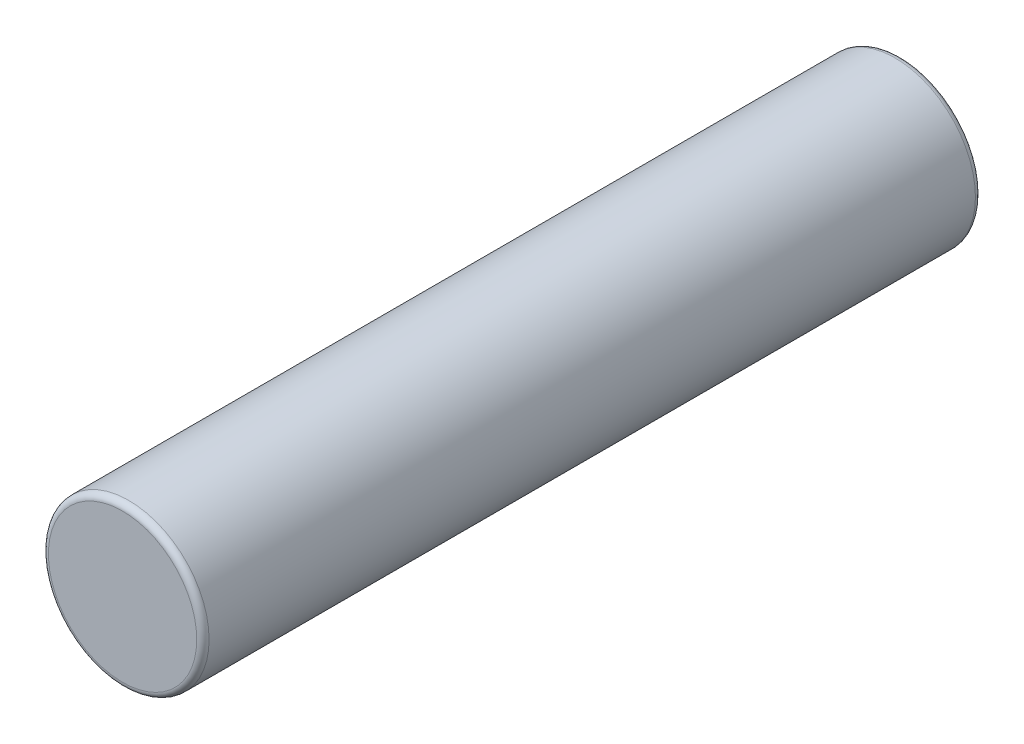
ISO-10303-21;
HEADER;
FILE_DESCRIPTION(('STEP AP214'),'2;1');
FILE_NAME('part.step','',(''),(''),'','','');
FILE_SCHEMA(('AUTOMOTIVE_DESIGN { 1 0 10303 214 1 1 1 1 }'));
ENDSEC;
DATA;
#1=APPLICATION_CONTEXT('core data for automotive mechanical design processes');
#2=APPLICATION_PROTOCOL_DEFINITION('international standard','automotive_design',2000,#1);
#3=PRODUCT_CONTEXT('',#1,'mechanical');
#4=PRODUCT('Part','Part','',(#3));
#5=PRODUCT_RELATED_PRODUCT_CATEGORY('part','',(#4));
#6=PRODUCT_DEFINITION_FORMATION('','',#4);
#7=PRODUCT_DEFINITION_CONTEXT('part definition',#1,'design');
#8=PRODUCT_DEFINITION('design','',#6,#7);
#9=PRODUCT_DEFINITION_SHAPE('','',#8);
#10=(LENGTH_UNIT() NAMED_UNIT(*) SI_UNIT(.MILLI.,.METRE.));
#11=(NAMED_UNIT(*) PLANE_ANGLE_UNIT() SI_UNIT($,.RADIAN.));
#12=(NAMED_UNIT(*) SI_UNIT($,.STERADIAN.) SOLID_ANGLE_UNIT());
#13=UNCERTAINTY_MEASURE_WITH_UNIT(LENGTH_MEASURE(1.E-05),#10,'distance_accuracy_value','');
#14=(GEOMETRIC_REPRESENTATION_CONTEXT(3) GLOBAL_UNCERTAINTY_ASSIGNED_CONTEXT((#13)) GLOBAL_UNIT_ASSIGNED_CONTEXT((#10,
#11,#12)) REPRESENTATION_CONTEXT('',''));
#15=CARTESIAN_POINT('',(0.,0.,0.));
#16=DIRECTION('',(0.,0.,1.));
#17=DIRECTION('',(1.,0.,0.));
#18=AXIS2_PLACEMENT_3D('',#15,#16,#17);
#19=CARTESIAN_POINT('',(0.,0.,63.));
#20=DIRECTION('',(0.,0.,-1.));
#21=DIRECTION('',(-1.,0.,0.));
#22=AXIS2_PLACEMENT_3D('',#19,#20,#21);
#23=CYLINDRICAL_SURFACE('',#22,6.5);
#24=CARTESIAN_POINT('',(0.,0.,0.5));
#25=DIRECTION('',(0.,0.,1.));
#26=DIRECTION('',(1.,0.,0.));
#27=AXIS2_PLACEMENT_3D('',#24,#25,#26);
#28=CIRCLE('',#27,6.5);
#29=CARTESIAN_POINT('',(6.5,0.,0.5));
#30=VERTEX_POINT('',#29);
#31=EDGE_CURVE('E44',#30,#30,#28,.T.);
#32=ORIENTED_EDGE('',*,*,#31,.T.);
#33=EDGE_LOOP('',(#32));
#34=FACE_BOUND('',#33,.T.);
#35=CARTESIAN_POINT('',(0.,0.,62.5));
#36=DIRECTION('',(0.,0.,1.));
#37=DIRECTION('',(1.,0.,0.));
#38=AXIS2_PLACEMENT_3D('',#35,#36,#37);
#39=CIRCLE('',#38,6.5);
#40=CARTESIAN_POINT('',(6.5,0.,62.5));
#41=VERTEX_POINT('',#40);
#42=EDGE_CURVE('E48',#41,#41,#39,.F.);
#43=ORIENTED_EDGE('',*,*,#42,.T.);
#44=EDGE_LOOP('',(#43));
#45=FACE_BOUND('',#44,.T.);
#46=ADVANCED_FACE('F33',(#34,#45),#23,.T.);
#47=CARTESIAN_POINT('',(0.,0.,63.));
#48=DIRECTION('',(0.,0.,1.));
#49=DIRECTION('',(1.,0.,0.));
#50=AXIS2_PLACEMENT_3D('',#47,#48,#49);
#51=PLANE('',#50);
#52=CARTESIAN_POINT('',(0.,0.,63.));
#53=DIRECTION('',(0.,0.,1.));
#54=DIRECTION('',(1.,0.,0.));
#55=AXIS2_PLACEMENT_3D('',#52,#53,#54);
#56=CIRCLE('',#55,6.);
#57=CARTESIAN_POINT('',(6.,0.,63.));
#58=VERTEX_POINT('',#57);
#59=EDGE_CURVE('E10',#58,#58,#56,.T.);
#60=ORIENTED_EDGE('',*,*,#59,.T.);
#61=EDGE_LOOP('',(#60));
#62=FACE_BOUND('',#61,.T.);
#63=ADVANCED_FACE('F64',(#62),#51,.T.);
#64=CARTESIAN_POINT('',(0.,0.,0.));
#65=DIRECTION('',(0.,0.,1.));
#66=DIRECTION('',(1.,0.,0.));
#67=AXIS2_PLACEMENT_3D('',#64,#65,#66);
#68=PLANE('',#67);
#69=CARTESIAN_POINT('',(0.,0.,0.));
#70=DIRECTION('',(0.,0.,1.));
#71=DIRECTION('',(1.,0.,0.));
#72=AXIS2_PLACEMENT_3D('',#69,#70,#71);
#73=CIRCLE('',#72,6.);
#74=CARTESIAN_POINT('',(6.,0.,0.));
#75=VERTEX_POINT('',#74);
#76=EDGE_CURVE('E40',#75,#75,#73,.F.);
#77=ORIENTED_EDGE('',*,*,#76,.T.);
#78=EDGE_LOOP('',(#77));
#79=FACE_BOUND('',#78,.T.);
#80=ADVANCED_FACE('F61',(#79),#68,.F.);
#81=CARTESIAN_POINT('',(0.,0.,0.5));
#82=DIRECTION('',(0.,0.,1.));
#83=DIRECTION('',(1.,0.,0.));
#84=AXIS2_PLACEMENT_3D('',#81,#82,#83);
#85=TOROIDAL_SURFACE('',#84,6.,0.5);
#86=ORIENTED_EDGE('',*,*,#76,.F.);
#87=EDGE_LOOP('',(#86));
#88=FACE_BOUND('',#87,.T.);
#89=ORIENTED_EDGE('',*,*,#31,.F.);
#90=EDGE_LOOP('',(#89));
#91=FACE_BOUND('',#90,.T.);
#92=ADVANCED_FACE('F57',(#88,#91),#85,.T.);
#93=CARTESIAN_POINT('',(0.,0.,62.5));
#94=DIRECTION('',(0.,0.,1.));
#95=DIRECTION('',(1.,0.,0.));
#96=AXIS2_PLACEMENT_3D('',#93,#94,#95);
#97=TOROIDAL_SURFACE('',#96,6.,0.5);
#98=ORIENTED_EDGE('',*,*,#42,.F.);
#99=EDGE_LOOP('',(#98));
#100=FACE_BOUND('',#99,.T.);
#101=ORIENTED_EDGE('',*,*,#59,.F.);
#102=EDGE_LOOP('',(#101));
#103=FACE_BOUND('',#102,.T.);
#104=ADVANCED_FACE('F35',(#100,#103),#97,.T.);
#105=CLOSED_SHELL('',(#46,#63,#80,#92,#104));
#106=MANIFOLD_SOLID_BREP('B2',#105);
#107=ADVANCED_BREP_SHAPE_REPRESENTATION('',(#18,#106),#14);
#108=SHAPE_DEFINITION_REPRESENTATION(#9,#107);
ENDSEC;
END-ISO-10303-21;
